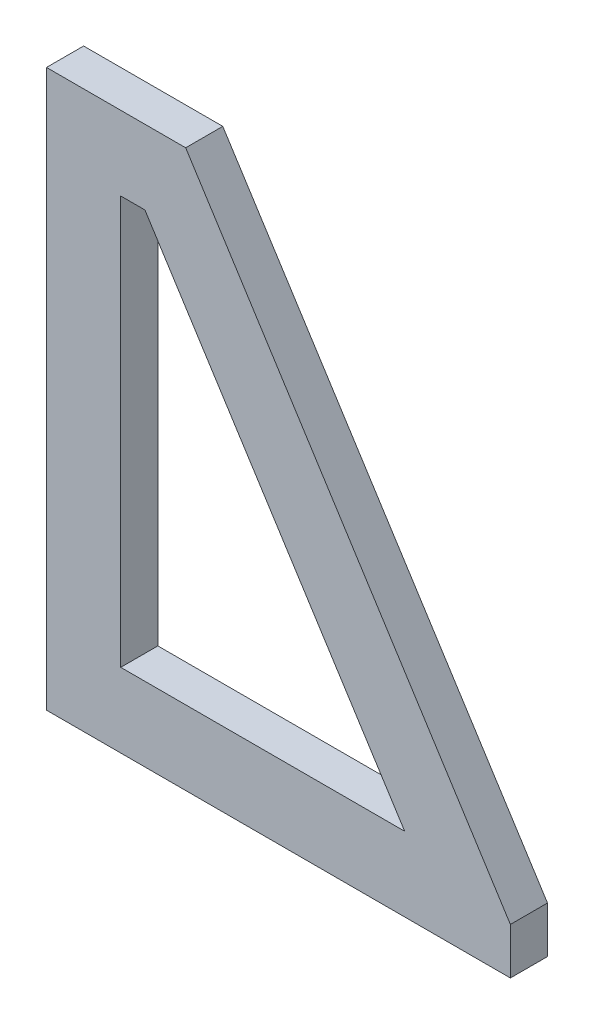
ISO-10303-21;
HEADER;
FILE_DESCRIPTION(('STEP AP214'),'2;1');
FILE_NAME('part.step','',(''),(''),'','','');
FILE_SCHEMA(('AUTOMOTIVE_DESIGN { 1 0 10303 214 1 1 1 1 }'));
ENDSEC;
DATA;
#1=APPLICATION_CONTEXT('core data for automotive mechanical design processes');
#2=APPLICATION_PROTOCOL_DEFINITION('international standard','automotive_design',2000,#1);
#3=PRODUCT_CONTEXT('',#1,'mechanical');
#4=PRODUCT('Part','Part','',(#3));
#5=PRODUCT_RELATED_PRODUCT_CATEGORY('part','',(#4));
#6=PRODUCT_DEFINITION_FORMATION('','',#4);
#7=PRODUCT_DEFINITION_CONTEXT('part definition',#1,'design');
#8=PRODUCT_DEFINITION('design','',#6,#7);
#9=PRODUCT_DEFINITION_SHAPE('','',#8);
#10=(LENGTH_UNIT() NAMED_UNIT(*) SI_UNIT(.MILLI.,.METRE.));
#11=(NAMED_UNIT(*) PLANE_ANGLE_UNIT() SI_UNIT($,.RADIAN.));
#12=(NAMED_UNIT(*) SI_UNIT($,.STERADIAN.) SOLID_ANGLE_UNIT());
#13=UNCERTAINTY_MEASURE_WITH_UNIT(LENGTH_MEASURE(1.E-05),#10,'distance_accuracy_value','');
#14=(GEOMETRIC_REPRESENTATION_CONTEXT(3) GLOBAL_UNCERTAINTY_ASSIGNED_CONTEXT((#13)) GLOBAL_UNIT_ASSIGNED_CONTEXT((#10,
#11,#12)) REPRESENTATION_CONTEXT('',''));
#15=CARTESIAN_POINT('',(0.,0.,0.));
#16=DIRECTION('',(0.,0.,1.));
#17=DIRECTION('',(1.,0.,0.));
#18=AXIS2_PLACEMENT_3D('',#15,#16,#17);
#19=CARTESIAN_POINT('',(0.,0.,4.));
#20=DIRECTION('',(0.,0.,1.));
#21=DIRECTION('',(1.,0.,0.));
#22=AXIS2_PLACEMENT_3D('',#19,#20,#21);
#23=PLANE('',#22);
#24=DIRECTION('',(0.,-1.,0.));
#25=VECTOR('',#24,1.);
#26=CARTESIAN_POINT('',(0.,120.,4.));
#27=LINE('',#26,#25);
#28=CARTESIAN_POINT('',(0.,120.,4.));
#29=VERTEX_POINT('',#28);
#30=CARTESIAN_POINT('',(0.,0.,4.));
#31=VERTEX_POINT('',#30);
#32=EDGE_CURVE('E142',#29,#31,#27,.T.);
#33=ORIENTED_EDGE('',*,*,#32,.T.);
#34=DIRECTION('',(1.,0.,0.));
#35=VECTOR('',#34,1.);
#36=CARTESIAN_POINT('',(0.,0.,4.));
#37=LINE('',#36,#35);
#38=CARTESIAN_POINT('',(100.,0.,4.));
#39=VERTEX_POINT('',#38);
#40=EDGE_CURVE('E145',#31,#39,#37,.T.);
#41=ORIENTED_EDGE('',*,*,#40,.T.);
#42=DIRECTION('',(0.,1.,0.));
#43=VECTOR('',#42,1.);
#44=CARTESIAN_POINT('',(100.,10.,4.));
#45=LINE('',#44,#43);
#46=CARTESIAN_POINT('',(100.,10.,4.));
#47=VERTEX_POINT('',#46);
#48=EDGE_CURVE('E148',#39,#47,#45,.T.);
#49=ORIENTED_EDGE('',*,*,#48,.T.);
#50=DIRECTION('',(-0.536875492193159,0.843661487732107,0.));
#51=VECTOR('',#50,1.);
#52=CARTESIAN_POINT('',(30.,120.,4.));
#53=LINE('',#52,#51);
#54=CARTESIAN_POINT('',(30.,120.,4.));
#55=VERTEX_POINT('',#54);
#56=EDGE_CURVE('E150',#47,#55,#53,.T.);
#57=ORIENTED_EDGE('',*,*,#56,.T.);
#58=DIRECTION('',(-1.,0.,0.));
#59=VECTOR('',#58,1.);
#60=CARTESIAN_POINT('',(0.,120.,4.));
#61=LINE('',#60,#59);
#62=EDGE_CURVE('E152',#55,#29,#61,.T.);
#63=ORIENTED_EDGE('',*,*,#62,.T.);
#64=EDGE_LOOP('',(#33,#41,#49,#57,#63));
#65=FACE_BOUND('',#64,.T.);
#66=DIRECTION('',(1.,0.,0.));
#67=VECTOR('',#66,1.);
#68=CARTESIAN_POINT('',(16.,16.,4.));
#69=LINE('',#68,#67);
#70=CARTESIAN_POINT('',(16.,16.,4.));
#71=VERTEX_POINT('',#70);
#72=CARTESIAN_POINT('',(77.2168657303196,16.,4.));
#73=VERTEX_POINT('',#72);
#74=EDGE_CURVE('E114',#71,#73,#69,.T.);
#75=ORIENTED_EDGE('',*,*,#74,.F.);
#76=DIRECTION('',(0.,-1.,0.));
#77=VECTOR('',#76,1.);
#78=CARTESIAN_POINT('',(16.,104.,4.));
#79=LINE('',#78,#77);
#80=CARTESIAN_POINT('',(16.,104.,4.));
#81=VERTEX_POINT('',#80);
#82=EDGE_CURVE('E106',#81,#71,#79,.T.);
#83=ORIENTED_EDGE('',*,*,#82,.F.);
#84=DIRECTION('',(-1.,0.,0.));
#85=VECTOR('',#84,1.);
#86=CARTESIAN_POINT('',(16.,104.,4.));
#87=LINE('',#86,#85);
#88=CARTESIAN_POINT('',(21.2168657303196,104.,4.));
#89=VERTEX_POINT('',#88);
#90=EDGE_CURVE('E128',#89,#81,#87,.T.);
#91=ORIENTED_EDGE('',*,*,#90,.F.);
#92=DIRECTION('',(-0.536875492193159,0.843661487732107,0.));
#93=VECTOR('',#92,1.);
#94=CARTESIAN_POINT('',(21.2168657303196,104.,4.));
#95=LINE('',#94,#93);
#96=EDGE_CURVE('E126',#73,#89,#95,.T.);
#97=ORIENTED_EDGE('',*,*,#96,.F.);
#98=EDGE_LOOP('',(#75,#83,#91,#97));
#99=FACE_BOUND('',#98,.T.);
#100=ADVANCED_FACE('F35',(#65,#99),#23,.T.);
#101=CARTESIAN_POINT('',(0.,0.,-4.));
#102=DIRECTION('',(0.,0.,1.));
#103=DIRECTION('',(1.,0.,0.));
#104=AXIS2_PLACEMENT_3D('',#101,#102,#103);
#105=PLANE('',#104);
#106=DIRECTION('',(0.,-1.,0.));
#107=VECTOR('',#106,1.);
#108=CARTESIAN_POINT('',(0.,120.,-4.));
#109=LINE('',#108,#107);
#110=CARTESIAN_POINT('',(0.,120.,-4.));
#111=VERTEX_POINT('',#110);
#112=CARTESIAN_POINT('',(0.,0.,-4.));
#113=VERTEX_POINT('',#112);
#114=EDGE_CURVE('E122',#111,#113,#109,.T.);
#115=ORIENTED_EDGE('',*,*,#114,.F.);
#116=DIRECTION('',(-1.,0.,0.));
#117=VECTOR('',#116,1.);
#118=CARTESIAN_POINT('',(0.,120.,-4.));
#119=LINE('',#118,#117);
#120=CARTESIAN_POINT('',(30.,120.,-4.));
#121=VERTEX_POINT('',#120);
#122=EDGE_CURVE('E146',#121,#111,#119,.T.);
#123=ORIENTED_EDGE('',*,*,#122,.F.);
#124=DIRECTION('',(-0.536875492193159,0.843661487732107,0.));
#125=VECTOR('',#124,1.);
#126=CARTESIAN_POINT('',(30.,120.,-4.));
#127=LINE('',#126,#125);
#128=CARTESIAN_POINT('',(100.,10.,-4.));
#129=VERTEX_POINT('',#128);
#130=EDGE_CURVE('E161',#129,#121,#127,.T.);
#131=ORIENTED_EDGE('',*,*,#130,.F.);
#132=DIRECTION('',(0.,1.,0.));
#133=VECTOR('',#132,1.);
#134=CARTESIAN_POINT('',(100.,10.,-4.));
#135=LINE('',#134,#133);
#136=CARTESIAN_POINT('',(100.,0.,-4.));
#137=VERTEX_POINT('',#136);
#138=EDGE_CURVE('E159',#137,#129,#135,.T.);
#139=ORIENTED_EDGE('',*,*,#138,.F.);
#140=DIRECTION('',(1.,0.,0.));
#141=VECTOR('',#140,1.);
#142=CARTESIAN_POINT('',(0.,0.,-4.));
#143=LINE('',#142,#141);
#144=EDGE_CURVE('E157',#113,#137,#143,.T.);
#145=ORIENTED_EDGE('',*,*,#144,.F.);
#146=EDGE_LOOP('',(#115,#123,#131,#139,#145));
#147=FACE_BOUND('',#146,.T.);
#148=DIRECTION('',(0.,-1.,0.));
#149=VECTOR('',#148,1.);
#150=CARTESIAN_POINT('',(16.,104.,-4.));
#151=LINE('',#150,#149);
#152=CARTESIAN_POINT('',(16.,104.,-4.));
#153=VERTEX_POINT('',#152);
#154=CARTESIAN_POINT('',(16.,16.,-4.));
#155=VERTEX_POINT('',#154);
#156=EDGE_CURVE('E58',#153,#155,#151,.T.);
#157=ORIENTED_EDGE('',*,*,#156,.T.);
#158=DIRECTION('',(1.,0.,0.));
#159=VECTOR('',#158,1.);
#160=CARTESIAN_POINT('',(16.,16.,-4.));
#161=LINE('',#160,#159);
#162=CARTESIAN_POINT('',(77.2168657303196,16.,-4.));
#163=VERTEX_POINT('',#162);
#164=EDGE_CURVE('E121',#155,#163,#161,.T.);
#165=ORIENTED_EDGE('',*,*,#164,.T.);
#166=DIRECTION('',(-0.536875492193159,0.843661487732107,0.));
#167=VECTOR('',#166,1.);
#168=CARTESIAN_POINT('',(21.2168657303196,104.,-4.));
#169=LINE('',#168,#167);
#170=CARTESIAN_POINT('',(21.2168657303196,104.,-4.));
#171=VERTEX_POINT('',#170);
#172=EDGE_CURVE('E134',#163,#171,#169,.T.);
#173=ORIENTED_EDGE('',*,*,#172,.T.);
#174=DIRECTION('',(-1.,0.,0.));
#175=VECTOR('',#174,1.);
#176=CARTESIAN_POINT('',(16.,104.,-4.));
#177=LINE('',#176,#175);
#178=EDGE_CURVE('E115',#171,#153,#177,.T.);
#179=ORIENTED_EDGE('',*,*,#178,.T.);
#180=EDGE_LOOP('',(#157,#165,#173,#179));
#181=FACE_BOUND('',#180,.T.);
#182=ADVANCED_FACE('F182',(#147,#181),#105,.F.);
#183=CARTESIAN_POINT('',(0.,120.,4.));
#184=DIRECTION('',(1.,0.,0.));
#185=DIRECTION('',(0.,1.,0.));
#186=AXIS2_PLACEMENT_3D('',#183,#184,#185);
#187=PLANE('',#186);
#188=ORIENTED_EDGE('',*,*,#114,.T.);
#189=DIRECTION('',(0.,0.,-1.));
#190=VECTOR('',#189,1.);
#191=CARTESIAN_POINT('',(0.,0.,4.));
#192=LINE('',#191,#190);
#193=EDGE_CURVE('E11',#31,#113,#192,.T.);
#194=ORIENTED_EDGE('',*,*,#193,.F.);
#195=ORIENTED_EDGE('',*,*,#32,.F.);
#196=DIRECTION('',(0.,0.,-1.));
#197=VECTOR('',#196,1.);
#198=CARTESIAN_POINT('',(0.,120.,4.));
#199=LINE('',#198,#197);
#200=EDGE_CURVE('E154',#29,#111,#199,.T.);
#201=ORIENTED_EDGE('',*,*,#200,.T.);
#202=EDGE_LOOP('',(#188,#194,#195,#201));
#203=FACE_BOUND('',#202,.T.);
#204=ADVANCED_FACE('F37',(#203),#187,.F.);
#205=CARTESIAN_POINT('',(0.,0.,4.));
#206=DIRECTION('',(0.,1.,0.));
#207=DIRECTION('',(0.,0.,1.));
#208=AXIS2_PLACEMENT_3D('',#205,#206,#207);
#209=PLANE('',#208);
#210=ORIENTED_EDGE('',*,*,#144,.T.);
#211=DIRECTION('',(0.,0.,-1.));
#212=VECTOR('',#211,1.);
#213=CARTESIAN_POINT('',(100.,0.,4.));
#214=LINE('',#213,#212);
#215=EDGE_CURVE('E43',#39,#137,#214,.T.);
#216=ORIENTED_EDGE('',*,*,#215,.F.);
#217=ORIENTED_EDGE('',*,*,#40,.F.);
#218=ORIENTED_EDGE('',*,*,#193,.T.);
#219=EDGE_LOOP('',(#210,#216,#217,#218));
#220=FACE_BOUND('',#219,.T.);
#221=ADVANCED_FACE('F196',(#220),#209,.F.);
#222=CARTESIAN_POINT('',(100.,10.,4.));
#223=DIRECTION('',(-1.,0.,0.));
#224=DIRECTION('',(0.,0.,1.));
#225=AXIS2_PLACEMENT_3D('',#222,#223,#224);
#226=PLANE('',#225);
#227=ORIENTED_EDGE('',*,*,#138,.T.);
#228=DIRECTION('',(0.,0.,-1.));
#229=VECTOR('',#228,1.);
#230=CARTESIAN_POINT('',(100.,10.,4.));
#231=LINE('',#230,#229);
#232=EDGE_CURVE('E169',#47,#129,#231,.T.);
#233=ORIENTED_EDGE('',*,*,#232,.F.);
#234=ORIENTED_EDGE('',*,*,#48,.F.);
#235=ORIENTED_EDGE('',*,*,#215,.T.);
#236=EDGE_LOOP('',(#227,#233,#234,#235));
#237=FACE_BOUND('',#236,.T.);
#238=ADVANCED_FACE('F176',(#237),#226,.F.);
#239=CARTESIAN_POINT('',(30.,120.,4.));
#240=DIRECTION('',(-0.843661487732107,-0.536875492193159,0.));
#241=DIRECTION('',(0.536875492193159,-0.843661487732107,0.));
#242=AXIS2_PLACEMENT_3D('',#239,#240,#241);
#243=PLANE('',#242);
#244=ORIENTED_EDGE('',*,*,#130,.T.);
#245=DIRECTION('',(0.,0.,-1.));
#246=VECTOR('',#245,1.);
#247=CARTESIAN_POINT('',(30.,120.,4.));
#248=LINE('',#247,#246);
#249=EDGE_CURVE('E166',#55,#121,#248,.T.);
#250=ORIENTED_EDGE('',*,*,#249,.F.);
#251=ORIENTED_EDGE('',*,*,#56,.F.);
#252=ORIENTED_EDGE('',*,*,#232,.T.);
#253=EDGE_LOOP('',(#244,#250,#251,#252));
#254=FACE_BOUND('',#253,.T.);
#255=ADVANCED_FACE('F187',(#254),#243,.F.);
#256=CARTESIAN_POINT('',(0.,120.,4.));
#257=DIRECTION('',(0.,-1.,0.));
#258=DIRECTION('',(0.,0.,-1.));
#259=AXIS2_PLACEMENT_3D('',#256,#257,#258);
#260=PLANE('',#259);
#261=ORIENTED_EDGE('',*,*,#122,.T.);
#262=ORIENTED_EDGE('',*,*,#200,.F.);
#263=ORIENTED_EDGE('',*,*,#62,.F.);
#264=ORIENTED_EDGE('',*,*,#249,.T.);
#265=EDGE_LOOP('',(#261,#262,#263,#264));
#266=FACE_BOUND('',#265,.T.);
#267=ADVANCED_FACE('F191',(#266),#260,.F.);
#268=CARTESIAN_POINT('',(16.,104.,4.));
#269=DIRECTION('',(1.,0.,0.));
#270=DIRECTION('',(0.,1.,0.));
#271=AXIS2_PLACEMENT_3D('',#268,#269,#270);
#272=PLANE('',#271);
#273=ORIENTED_EDGE('',*,*,#156,.F.);
#274=DIRECTION('',(0.,0.,-1.));
#275=VECTOR('',#274,1.);
#276=CARTESIAN_POINT('',(16.,104.,4.));
#277=LINE('',#276,#275);
#278=EDGE_CURVE('E110',#81,#153,#277,.T.);
#279=ORIENTED_EDGE('',*,*,#278,.F.);
#280=ORIENTED_EDGE('',*,*,#82,.T.);
#281=DIRECTION('',(0.,0.,-1.));
#282=VECTOR('',#281,1.);
#283=CARTESIAN_POINT('',(16.,16.,4.));
#284=LINE('',#283,#282);
#285=EDGE_CURVE('E109',#71,#155,#284,.T.);
#286=ORIENTED_EDGE('',*,*,#285,.T.);
#287=EDGE_LOOP('',(#273,#279,#280,#286));
#288=FACE_BOUND('',#287,.T.);
#289=ADVANCED_FACE('F108',(#288),#272,.T.);
#290=CARTESIAN_POINT('',(16.,16.,4.));
#291=DIRECTION('',(0.,1.,0.));
#292=DIRECTION('',(0.,0.,1.));
#293=AXIS2_PLACEMENT_3D('',#290,#291,#292);
#294=PLANE('',#293);
#295=ORIENTED_EDGE('',*,*,#164,.F.);
#296=ORIENTED_EDGE('',*,*,#285,.F.);
#297=ORIENTED_EDGE('',*,*,#74,.T.);
#298=DIRECTION('',(0.,0.,-1.));
#299=VECTOR('',#298,1.);
#300=CARTESIAN_POINT('',(77.2168657303196,16.,4.));
#301=LINE('',#300,#299);
#302=EDGE_CURVE('E123',#73,#163,#301,.T.);
#303=ORIENTED_EDGE('',*,*,#302,.T.);
#304=EDGE_LOOP('',(#295,#296,#297,#303));
#305=FACE_BOUND('',#304,.T.);
#306=ADVANCED_FACE('F118',(#305),#294,.T.);
#307=CARTESIAN_POINT('',(21.2168657303196,104.,4.));
#308=DIRECTION('',(-0.843661487732107,-0.536875492193159,0.));
#309=DIRECTION('',(0.536875492193159,-0.843661487732107,0.));
#310=AXIS2_PLACEMENT_3D('',#307,#308,#309);
#311=PLANE('',#310);
#312=ORIENTED_EDGE('',*,*,#172,.F.);
#313=ORIENTED_EDGE('',*,*,#302,.F.);
#314=ORIENTED_EDGE('',*,*,#96,.T.);
#315=DIRECTION('',(0.,0.,-1.));
#316=VECTOR('',#315,1.);
#317=CARTESIAN_POINT('',(21.2168657303196,104.,4.));
#318=LINE('',#317,#316);
#319=EDGE_CURVE('E50',#89,#171,#318,.T.);
#320=ORIENTED_EDGE('',*,*,#319,.T.);
#321=EDGE_LOOP('',(#312,#313,#314,#320));
#322=FACE_BOUND('',#321,.T.);
#323=ADVANCED_FACE('F239',(#322),#311,.T.);
#324=CARTESIAN_POINT('',(16.,104.,4.));
#325=DIRECTION('',(0.,-1.,0.));
#326=DIRECTION('',(0.,0.,-1.));
#327=AXIS2_PLACEMENT_3D('',#324,#325,#326);
#328=PLANE('',#327);
#329=ORIENTED_EDGE('',*,*,#178,.F.);
#330=ORIENTED_EDGE('',*,*,#319,.F.);
#331=ORIENTED_EDGE('',*,*,#90,.T.);
#332=ORIENTED_EDGE('',*,*,#278,.T.);
#333=EDGE_LOOP('',(#329,#330,#331,#332));
#334=FACE_BOUND('',#333,.T.);
#335=ADVANCED_FACE('F245',(#334),#328,.T.);
#336=CLOSED_SHELL('',(#100,#182,#204,#221,#238,#255,#267,#289,#306,#323,#335));
#337=MANIFOLD_SOLID_BREP('B2',#336);
#338=ADVANCED_BREP_SHAPE_REPRESENTATION('',(#18,#337),#14);
#339=SHAPE_DEFINITION_REPRESENTATION(#9,#338);
ENDSEC;
END-ISO-10303-21;
